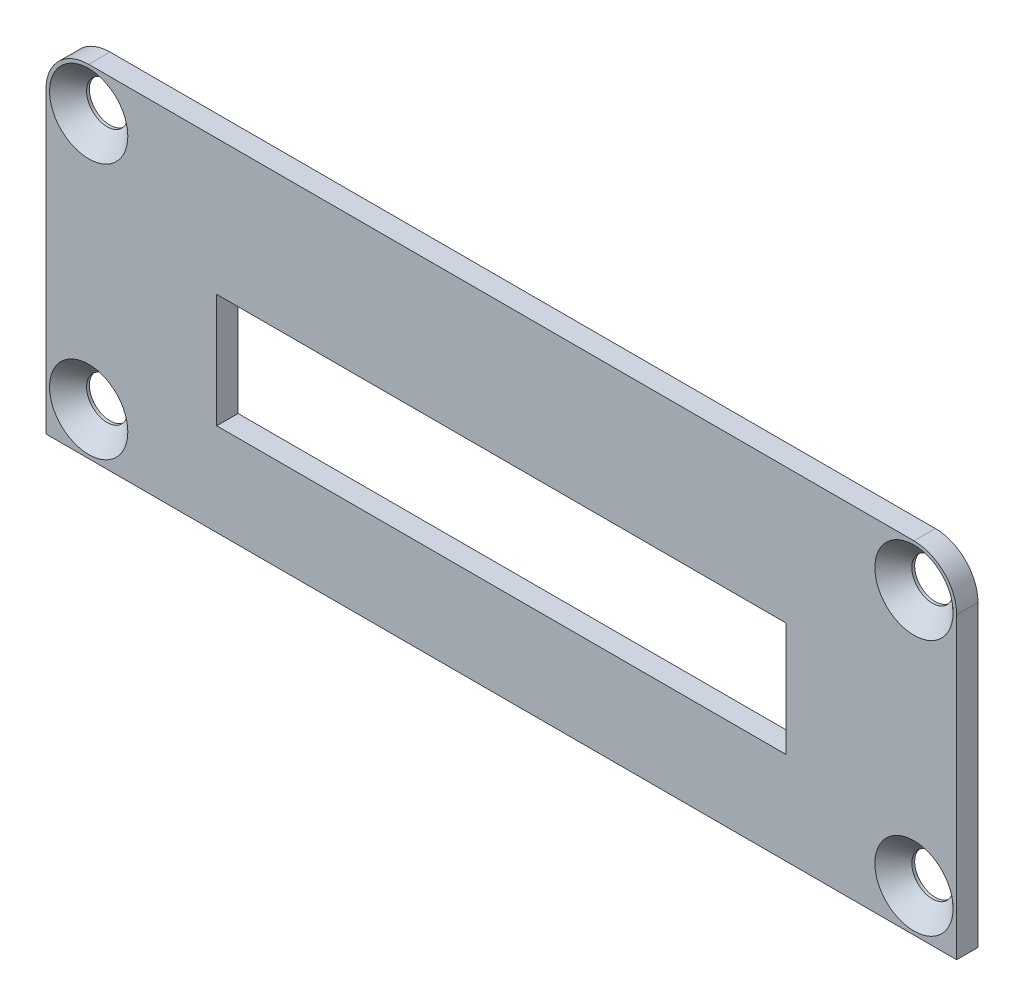
ISO-10303-21;
HEADER;
FILE_DESCRIPTION(('STEP AP214'),'2;1');
FILE_NAME('part.step','',(''),(''),'','','');
FILE_SCHEMA(('AUTOMOTIVE_DESIGN { 1 0 10303 214 1 1 1 1 }'));
ENDSEC;
DATA;
#1=APPLICATION_CONTEXT('core data for automotive mechanical design processes');
#2=APPLICATION_PROTOCOL_DEFINITION('international standard','automotive_design',2000,#1);
#3=PRODUCT_CONTEXT('',#1,'mechanical');
#4=PRODUCT('Part','Part','',(#3));
#5=PRODUCT_RELATED_PRODUCT_CATEGORY('part','',(#4));
#6=PRODUCT_DEFINITION_FORMATION('','',#4);
#7=PRODUCT_DEFINITION_CONTEXT('part definition',#1,'design');
#8=PRODUCT_DEFINITION('design','',#6,#7);
#9=PRODUCT_DEFINITION_SHAPE('','',#8);
#10=(LENGTH_UNIT() NAMED_UNIT(*) SI_UNIT(.MILLI.,.METRE.));
#11=(NAMED_UNIT(*) PLANE_ANGLE_UNIT() SI_UNIT($,.RADIAN.));
#12=(NAMED_UNIT(*) SI_UNIT($,.STERADIAN.) SOLID_ANGLE_UNIT());
#13=UNCERTAINTY_MEASURE_WITH_UNIT(LENGTH_MEASURE(1.E-05),#10,'distance_accuracy_value','');
#14=(GEOMETRIC_REPRESENTATION_CONTEXT(3) GLOBAL_UNCERTAINTY_ASSIGNED_CONTEXT((#13)) GLOBAL_UNIT_ASSIGNED_CONTEXT((#10,
#11,#12)) REPRESENTATION_CONTEXT('',''));
#15=CARTESIAN_POINT('',(0.,0.,0.));
#16=DIRECTION('',(0.,0.,1.));
#17=DIRECTION('',(1.,0.,0.));
#18=AXIS2_PLACEMENT_3D('',#15,#16,#17);
#19=CARTESIAN_POINT('',(32.,12.,-1.5));
#20=DIRECTION('',(1.,0.,0.));
#21=DIRECTION('',(0.,0.,-1.));
#22=AXIS2_PLACEMENT_3D('',#19,#20,#21);
#23=PLANE('',#22);
#24=DIRECTION('',(0.,1.,0.));
#25=VECTOR('',#24,1.);
#26=CARTESIAN_POINT('',(32.,12.,-1.5));
#27=LINE('',#26,#25);
#28=CARTESIAN_POINT('',(32.,-12.,-1.5));
#29=VERTEX_POINT('',#28);
#30=CARTESIAN_POINT('',(32.,9.,-1.5));
#31=VERTEX_POINT('',#30);
#32=EDGE_CURVE('E159',#29,#31,#27,.T.);
#33=ORIENTED_EDGE('',*,*,#32,.T.);
#34=DIRECTION('',(0.,0.,1.));
#35=VECTOR('',#34,1.);
#36=CARTESIAN_POINT('',(32.,9.,-1.5));
#37=LINE('',#36,#35);
#38=CARTESIAN_POINT('',(32.,9.,0.));
#39=VERTEX_POINT('',#38);
#40=EDGE_CURVE('E11',#31,#39,#37,.T.);
#41=ORIENTED_EDGE('',*,*,#40,.T.);
#42=DIRECTION('',(0.,1.,0.));
#43=VECTOR('',#42,1.);
#44=CARTESIAN_POINT('',(32.,12.,0.));
#45=LINE('',#44,#43);
#46=CARTESIAN_POINT('',(32.,-12.,0.));
#47=VERTEX_POINT('',#46);
#48=EDGE_CURVE('E155',#47,#39,#45,.T.);
#49=ORIENTED_EDGE('',*,*,#48,.F.);
#50=DIRECTION('',(0.,0.,1.));
#51=VECTOR('',#50,1.);
#52=CARTESIAN_POINT('',(32.,-12.,-1.5));
#53=LINE('',#52,#51);
#54=EDGE_CURVE('E180',#29,#47,#53,.T.);
#55=ORIENTED_EDGE('',*,*,#54,.F.);
#56=EDGE_LOOP('',(#33,#41,#49,#55));
#57=FACE_BOUND('',#56,.T.);
#58=ADVANCED_FACE('F33',(#57),#23,.T.);
#59=CARTESIAN_POINT('',(-32.,-12.,-1.5));
#60=DIRECTION('',(0.,-1.,0.));
#61=DIRECTION('',(0.,0.,-1.));
#62=AXIS2_PLACEMENT_3D('',#59,#60,#61);
#63=PLANE('',#62);
#64=DIRECTION('',(1.,0.,0.));
#65=VECTOR('',#64,1.);
#66=CARTESIAN_POINT('',(-32.,-12.,0.));
#67=LINE('',#66,#65);
#68=CARTESIAN_POINT('',(-32.,-12.,0.));
#69=VERTEX_POINT('',#68);
#70=EDGE_CURVE('E162',#69,#47,#67,.T.);
#71=ORIENTED_EDGE('',*,*,#70,.F.);
#72=DIRECTION('',(0.,0.,1.));
#73=VECTOR('',#72,1.);
#74=CARTESIAN_POINT('',(-32.,-12.,-1.5));
#75=LINE('',#74,#73);
#76=CARTESIAN_POINT('',(-32.,-12.,-1.5));
#77=VERTEX_POINT('',#76);
#78=EDGE_CURVE('E170',#77,#69,#75,.T.);
#79=ORIENTED_EDGE('',*,*,#78,.F.);
#80=DIRECTION('',(1.,0.,0.));
#81=VECTOR('',#80,1.);
#82=CARTESIAN_POINT('',(-32.,-12.,-1.5));
#83=LINE('',#82,#81);
#84=EDGE_CURVE('E167',#77,#29,#83,.T.);
#85=ORIENTED_EDGE('',*,*,#84,.T.);
#86=ORIENTED_EDGE('',*,*,#54,.T.);
#87=EDGE_LOOP('',(#71,#79,#85,#86));
#88=FACE_BOUND('',#87,.T.);
#89=ADVANCED_FACE('F209',(#88),#63,.T.);
#90=CARTESIAN_POINT('',(-32.,12.,-1.5));
#91=DIRECTION('',(-1.,0.,0.));
#92=DIRECTION('',(0.,0.,1.));
#93=AXIS2_PLACEMENT_3D('',#90,#91,#92);
#94=PLANE('',#93);
#95=DIRECTION('',(0.,-1.,0.));
#96=VECTOR('',#95,1.);
#97=CARTESIAN_POINT('',(-32.,12.,0.));
#98=LINE('',#97,#96);
#99=CARTESIAN_POINT('',(-32.,9.,0.));
#100=VERTEX_POINT('',#99);
#101=EDGE_CURVE('E176',#100,#69,#98,.T.);
#102=ORIENTED_EDGE('',*,*,#101,.F.);
#103=DIRECTION('',(0.,0.,1.));
#104=VECTOR('',#103,1.);
#105=CARTESIAN_POINT('',(-32.,9.,-1.5));
#106=LINE('',#105,#104);
#107=CARTESIAN_POINT('',(-32.,9.,-1.5));
#108=VERTEX_POINT('',#107);
#109=EDGE_CURVE('E56',#100,#108,#106,.F.);
#110=ORIENTED_EDGE('',*,*,#109,.T.);
#111=DIRECTION('',(0.,-1.,0.));
#112=VECTOR('',#111,1.);
#113=CARTESIAN_POINT('',(-32.,12.,-1.5));
#114=LINE('',#113,#112);
#115=EDGE_CURVE('E165',#108,#77,#114,.T.);
#116=ORIENTED_EDGE('',*,*,#115,.T.);
#117=ORIENTED_EDGE('',*,*,#78,.T.);
#118=EDGE_LOOP('',(#102,#110,#116,#117));
#119=FACE_BOUND('',#118,.T.);
#120=ADVANCED_FACE('F205',(#119),#94,.T.);
#121=CARTESIAN_POINT('',(-32.,12.,-1.5));
#122=DIRECTION('',(0.,1.,0.));
#123=DIRECTION('',(0.,0.,1.));
#124=AXIS2_PLACEMENT_3D('',#121,#122,#123);
#125=PLANE('',#124);
#126=DIRECTION('',(-1.,0.,0.));
#127=VECTOR('',#126,1.);
#128=CARTESIAN_POINT('',(-32.,12.,-1.5));
#129=LINE('',#128,#127);
#130=CARTESIAN_POINT('',(29.,12.,-1.5));
#131=VERTEX_POINT('',#130);
#132=CARTESIAN_POINT('',(-29.,12.,-1.5));
#133=VERTEX_POINT('',#132);
#134=EDGE_CURVE('E161',#131,#133,#129,.T.);
#135=ORIENTED_EDGE('',*,*,#134,.T.);
#136=DIRECTION('',(0.,0.,1.));
#137=VECTOR('',#136,1.);
#138=CARTESIAN_POINT('',(-29.,12.,-1.5));
#139=LINE('',#138,#137);
#140=CARTESIAN_POINT('',(-29.,12.,0.));
#141=VERTEX_POINT('',#140);
#142=EDGE_CURVE('E186',#133,#141,#139,.T.);
#143=ORIENTED_EDGE('',*,*,#142,.T.);
#144=DIRECTION('',(-1.,0.,0.));
#145=VECTOR('',#144,1.);
#146=CARTESIAN_POINT('',(-32.,12.,0.));
#147=LINE('',#146,#145);
#148=CARTESIAN_POINT('',(29.,12.,0.));
#149=VERTEX_POINT('',#148);
#150=EDGE_CURVE('E173',#149,#141,#147,.T.);
#151=ORIENTED_EDGE('',*,*,#150,.F.);
#152=DIRECTION('',(0.,0.,1.));
#153=VECTOR('',#152,1.);
#154=CARTESIAN_POINT('',(29.,12.,-1.5));
#155=LINE('',#154,#153);
#156=EDGE_CURVE('E182',#149,#131,#155,.F.);
#157=ORIENTED_EDGE('',*,*,#156,.T.);
#158=EDGE_LOOP('',(#135,#143,#151,#157));
#159=FACE_BOUND('',#158,.T.);
#160=ADVANCED_FACE('F199',(#159),#125,.T.);
#161=CARTESIAN_POINT('',(0.,0.,-1.5));
#162=DIRECTION('',(0.,0.,1.));
#163=DIRECTION('',(1.,0.,0.));
#164=AXIS2_PLACEMENT_3D('',#161,#162,#163);
#165=PLANE('',#164);
#166=CARTESIAN_POINT('',(-29.,9.,-1.5));
#167=DIRECTION('',(0.,0.,1.));
#168=DIRECTION('',(1.,0.,0.));
#169=AXIS2_PLACEMENT_3D('',#166,#167,#168);
#170=CIRCLE('',#169,1.45);
#171=CARTESIAN_POINT('',(-27.55,9.,-1.5));
#172=VERTEX_POINT('',#171);
#173=EDGE_CURVE('E288',#172,#172,#170,.T.);
#174=ORIENTED_EDGE('',*,*,#173,.T.);
#175=EDGE_LOOP('',(#174));
#176=FACE_BOUND('',#175,.T.);
#177=CARTESIAN_POINT('',(29.,9.,-1.5));
#178=DIRECTION('',(0.,0.,1.));
#179=DIRECTION('',(1.,0.,0.));
#180=AXIS2_PLACEMENT_3D('',#177,#178,#179);
#181=CIRCLE('',#180,1.45);
#182=CARTESIAN_POINT('',(30.45,9.,-1.5));
#183=VERTEX_POINT('',#182);
#184=EDGE_CURVE('E299',#183,#183,#181,.T.);
#185=ORIENTED_EDGE('',*,*,#184,.T.);
#186=EDGE_LOOP('',(#185));
#187=FACE_BOUND('',#186,.T.);
#188=CARTESIAN_POINT('',(-29.,-9.,-1.5));
#189=DIRECTION('',(0.,0.,1.));
#190=DIRECTION('',(1.,0.,0.));
#191=AXIS2_PLACEMENT_3D('',#188,#189,#190);
#192=CIRCLE('',#191,1.45);
#193=CARTESIAN_POINT('',(-27.55,-9.,-1.5));
#194=VERTEX_POINT('',#193);
#195=EDGE_CURVE('E308',#194,#194,#192,.T.);
#196=ORIENTED_EDGE('',*,*,#195,.T.);
#197=EDGE_LOOP('',(#196));
#198=FACE_BOUND('',#197,.T.);
#199=CARTESIAN_POINT('',(29.,-9.,-1.5));
#200=DIRECTION('',(0.,0.,1.));
#201=DIRECTION('',(1.,0.,0.));
#202=AXIS2_PLACEMENT_3D('',#199,#200,#201);
#203=CIRCLE('',#202,1.45);
#204=CARTESIAN_POINT('',(30.45,-9.,-1.5));
#205=VERTEX_POINT('',#204);
#206=EDGE_CURVE('E143',#205,#205,#203,.T.);
#207=ORIENTED_EDGE('',*,*,#206,.T.);
#208=EDGE_LOOP('',(#207));
#209=FACE_BOUND('',#208,.T.);
#210=DIRECTION('',(1.,0.,0.));
#211=VECTOR('',#210,1.);
#212=CARTESIAN_POINT('',(-20.,-5.5,-1.5));
#213=LINE('',#212,#211);
#214=CARTESIAN_POINT('',(-20.,-5.5,-1.5));
#215=VERTEX_POINT('',#214);
#216=CARTESIAN_POINT('',(20.,-5.5,-1.5));
#217=VERTEX_POINT('',#216);
#218=EDGE_CURVE('E125',#215,#217,#213,.T.);
#219=ORIENTED_EDGE('',*,*,#218,.T.);
#220=DIRECTION('',(0.,1.,0.));
#221=VECTOR('',#220,1.);
#222=CARTESIAN_POINT('',(20.,2.5,-1.5));
#223=LINE('',#222,#221);
#224=CARTESIAN_POINT('',(20.,2.5,-1.5));
#225=VERTEX_POINT('',#224);
#226=EDGE_CURVE('E117',#217,#225,#223,.T.);
#227=ORIENTED_EDGE('',*,*,#226,.T.);
#228=DIRECTION('',(-1.,0.,0.));
#229=VECTOR('',#228,1.);
#230=CARTESIAN_POINT('',(-20.,2.5,-1.5));
#231=LINE('',#230,#229);
#232=CARTESIAN_POINT('',(-20.,2.5,-1.5));
#233=VERTEX_POINT('',#232);
#234=EDGE_CURVE('E129',#225,#233,#231,.T.);
#235=ORIENTED_EDGE('',*,*,#234,.T.);
#236=DIRECTION('',(0.,-1.,0.));
#237=VECTOR('',#236,1.);
#238=CARTESIAN_POINT('',(-20.,2.5,-1.5));
#239=LINE('',#238,#237);
#240=EDGE_CURVE('E133',#233,#215,#239,.T.);
#241=ORIENTED_EDGE('',*,*,#240,.T.);
#242=EDGE_LOOP('',(#219,#227,#235,#241));
#243=FACE_BOUND('',#242,.T.);
#244=ORIENTED_EDGE('',*,*,#115,.F.);
#245=CARTESIAN_POINT('',(-29.,9.,-1.5));
#246=DIRECTION('',(0.,0.,1.));
#247=DIRECTION('',(1.,0.,0.));
#248=AXIS2_PLACEMENT_3D('',#245,#246,#247);
#249=CIRCLE('',#248,3.);
#250=EDGE_CURVE('E41',#108,#133,#249,.F.);
#251=ORIENTED_EDGE('',*,*,#250,.T.);
#252=ORIENTED_EDGE('',*,*,#134,.F.);
#253=CARTESIAN_POINT('',(29.,9.,-1.5));
#254=DIRECTION('',(0.,0.,1.));
#255=DIRECTION('',(1.,0.,0.));
#256=AXIS2_PLACEMENT_3D('',#253,#254,#255);
#257=CIRCLE('',#256,3.);
#258=EDGE_CURVE('E48',#131,#31,#257,.F.);
#259=ORIENTED_EDGE('',*,*,#258,.T.);
#260=ORIENTED_EDGE('',*,*,#32,.F.);
#261=ORIENTED_EDGE('',*,*,#84,.F.);
#262=EDGE_LOOP('',(#244,#251,#252,#259,#260,#261));
#263=FACE_BOUND('',#262,.T.);
#264=ADVANCED_FACE('F135',(#176,#187,#198,#209,#243,#263),#165,.F.);
#265=CARTESIAN_POINT('',(0.,0.,0.));
#266=DIRECTION('',(0.,0.,1.));
#267=DIRECTION('',(1.,0.,0.));
#268=AXIS2_PLACEMENT_3D('',#265,#266,#267);
#269=PLANE('',#268);
#270=CARTESIAN_POINT('',(-29.,9.,0.));
#271=DIRECTION('',(0.,0.,1.));
#272=DIRECTION('',(1.,0.,0.));
#273=AXIS2_PLACEMENT_3D('',#270,#271,#272);
#274=CIRCLE('',#273,2.75);
#275=CARTESIAN_POINT('',(-26.25,9.,0.));
#276=VERTEX_POINT('',#275);
#277=EDGE_CURVE('E286',#276,#276,#274,.T.);
#278=ORIENTED_EDGE('',*,*,#277,.F.);
#279=EDGE_LOOP('',(#278));
#280=FACE_BOUND('',#279,.T.);
#281=CARTESIAN_POINT('',(29.,9.,0.));
#282=DIRECTION('',(0.,0.,1.));
#283=DIRECTION('',(1.,0.,0.));
#284=AXIS2_PLACEMENT_3D('',#281,#282,#283);
#285=CIRCLE('',#284,2.75);
#286=CARTESIAN_POINT('',(31.75,9.,0.));
#287=VERTEX_POINT('',#286);
#288=EDGE_CURVE('E293',#287,#287,#285,.T.);
#289=ORIENTED_EDGE('',*,*,#288,.F.);
#290=EDGE_LOOP('',(#289));
#291=FACE_BOUND('',#290,.T.);
#292=CARTESIAN_POINT('',(-29.,-9.,0.));
#293=DIRECTION('',(0.,0.,1.));
#294=DIRECTION('',(1.,0.,0.));
#295=AXIS2_PLACEMENT_3D('',#292,#293,#294);
#296=CIRCLE('',#295,2.75);
#297=CARTESIAN_POINT('',(-26.25,-9.,0.));
#298=VERTEX_POINT('',#297);
#299=EDGE_CURVE('E302',#298,#298,#296,.T.);
#300=ORIENTED_EDGE('',*,*,#299,.F.);
#301=EDGE_LOOP('',(#300));
#302=FACE_BOUND('',#301,.T.);
#303=CARTESIAN_POINT('',(29.,-9.,0.));
#304=DIRECTION('',(0.,0.,1.));
#305=DIRECTION('',(1.,0.,0.));
#306=AXIS2_PLACEMENT_3D('',#303,#304,#305);
#307=CIRCLE('',#306,2.75);
#308=CARTESIAN_POINT('',(31.75,-9.,0.));
#309=VERTEX_POINT('',#308);
#310=EDGE_CURVE('E311',#309,#309,#307,.T.);
#311=ORIENTED_EDGE('',*,*,#310,.F.);
#312=EDGE_LOOP('',(#311));
#313=FACE_BOUND('',#312,.T.);
#314=DIRECTION('',(0.,1.,0.));
#315=VECTOR('',#314,1.);
#316=CARTESIAN_POINT('',(20.,2.5,0.));
#317=LINE('',#316,#315);
#318=CARTESIAN_POINT('',(20.,-5.5,0.));
#319=VERTEX_POINT('',#318);
#320=CARTESIAN_POINT('',(20.,2.5,0.));
#321=VERTEX_POINT('',#320);
#322=EDGE_CURVE('E120',#319,#321,#317,.T.);
#323=ORIENTED_EDGE('',*,*,#322,.F.);
#324=DIRECTION('',(1.,0.,0.));
#325=VECTOR('',#324,1.);
#326=CARTESIAN_POINT('',(-20.,-5.5,0.));
#327=LINE('',#326,#325);
#328=CARTESIAN_POINT('',(-20.,-5.5,0.));
#329=VERTEX_POINT('',#328);
#330=EDGE_CURVE('E137',#329,#319,#327,.T.);
#331=ORIENTED_EDGE('',*,*,#330,.F.);
#332=DIRECTION('',(0.,-1.,0.));
#333=VECTOR('',#332,1.);
#334=CARTESIAN_POINT('',(-20.,2.5,0.));
#335=LINE('',#334,#333);
#336=CARTESIAN_POINT('',(-20.,2.5,0.));
#337=VERTEX_POINT('',#336);
#338=EDGE_CURVE('E140',#337,#329,#335,.T.);
#339=ORIENTED_EDGE('',*,*,#338,.F.);
#340=DIRECTION('',(-1.,0.,0.));
#341=VECTOR('',#340,1.);
#342=CARTESIAN_POINT('',(-20.,2.5,0.));
#343=LINE('',#342,#341);
#344=EDGE_CURVE('E149',#321,#337,#343,.T.);
#345=ORIENTED_EDGE('',*,*,#344,.F.);
#346=EDGE_LOOP('',(#323,#331,#339,#345));
#347=FACE_BOUND('',#346,.T.);
#348=ORIENTED_EDGE('',*,*,#150,.T.);
#349=CARTESIAN_POINT('',(-29.,9.,0.));
#350=DIRECTION('',(0.,0.,1.));
#351=DIRECTION('',(1.,0.,0.));
#352=AXIS2_PLACEMENT_3D('',#349,#350,#351);
#353=CIRCLE('',#352,3.);
#354=EDGE_CURVE('E191',#141,#100,#353,.T.);
#355=ORIENTED_EDGE('',*,*,#354,.T.);
#356=ORIENTED_EDGE('',*,*,#101,.T.);
#357=ORIENTED_EDGE('',*,*,#70,.T.);
#358=ORIENTED_EDGE('',*,*,#48,.T.);
#359=CARTESIAN_POINT('',(29.,9.,0.));
#360=DIRECTION('',(0.,0.,1.));
#361=DIRECTION('',(1.,0.,0.));
#362=AXIS2_PLACEMENT_3D('',#359,#360,#361);
#363=CIRCLE('',#362,3.);
#364=EDGE_CURVE('E189',#39,#149,#363,.T.);
#365=ORIENTED_EDGE('',*,*,#364,.T.);
#366=EDGE_LOOP('',(#348,#355,#356,#357,#358,#365));
#367=FACE_BOUND('',#366,.T.);
#368=ADVANCED_FACE('F204',(#280,#291,#302,#313,#347,#367),#269,.T.);
#369=CARTESIAN_POINT('',(20.,2.5,-1.5));
#370=DIRECTION('',(1.,0.,0.));
#371=DIRECTION('',(0.,1.,0.));
#372=AXIS2_PLACEMENT_3D('',#369,#370,#371);
#373=PLANE('',#372);
#374=ORIENTED_EDGE('',*,*,#322,.T.);
#375=DIRECTION('',(0.,0.,1.));
#376=VECTOR('',#375,1.);
#377=CARTESIAN_POINT('',(20.,2.5,-1.5));
#378=LINE('',#377,#376);
#379=EDGE_CURVE('E113',#225,#321,#378,.T.);
#380=ORIENTED_EDGE('',*,*,#379,.F.);
#381=ORIENTED_EDGE('',*,*,#226,.F.);
#382=DIRECTION('',(0.,0.,1.));
#383=VECTOR('',#382,1.);
#384=CARTESIAN_POINT('',(20.,-5.5,-1.5));
#385=LINE('',#384,#383);
#386=EDGE_CURVE('E153',#217,#319,#385,.T.);
#387=ORIENTED_EDGE('',*,*,#386,.T.);
#388=EDGE_LOOP('',(#374,#380,#381,#387));
#389=FACE_BOUND('',#388,.T.);
#390=ADVANCED_FACE('F115',(#389),#373,.F.);
#391=CARTESIAN_POINT('',(-20.,-5.5,-1.5));
#392=DIRECTION('',(0.,-1.,0.));
#393=DIRECTION('',(0.,0.,-1.));
#394=AXIS2_PLACEMENT_3D('',#391,#392,#393);
#395=PLANE('',#394);
#396=ORIENTED_EDGE('',*,*,#330,.T.);
#397=ORIENTED_EDGE('',*,*,#386,.F.);
#398=ORIENTED_EDGE('',*,*,#218,.F.);
#399=DIRECTION('',(0.,0.,1.));
#400=VECTOR('',#399,1.);
#401=CARTESIAN_POINT('',(-20.,-5.5,-1.5));
#402=LINE('',#401,#400);
#403=EDGE_CURVE('E156',#215,#329,#402,.T.);
#404=ORIENTED_EDGE('',*,*,#403,.T.);
#405=EDGE_LOOP('',(#396,#397,#398,#404));
#406=FACE_BOUND('',#405,.T.);
#407=ADVANCED_FACE('F242',(#406),#395,.F.);
#408=CARTESIAN_POINT('',(-20.,2.5,-1.5));
#409=DIRECTION('',(-1.,0.,0.));
#410=DIRECTION('',(0.,-1.,0.));
#411=AXIS2_PLACEMENT_3D('',#408,#409,#410);
#412=PLANE('',#411);
#413=ORIENTED_EDGE('',*,*,#338,.T.);
#414=ORIENTED_EDGE('',*,*,#403,.F.);
#415=ORIENTED_EDGE('',*,*,#240,.F.);
#416=DIRECTION('',(0.,0.,1.));
#417=VECTOR('',#416,1.);
#418=CARTESIAN_POINT('',(-20.,2.5,-1.5));
#419=LINE('',#418,#417);
#420=EDGE_CURVE('E124',#233,#337,#419,.T.);
#421=ORIENTED_EDGE('',*,*,#420,.T.);
#422=EDGE_LOOP('',(#413,#414,#415,#421));
#423=FACE_BOUND('',#422,.T.);
#424=ADVANCED_FACE('F245',(#423),#412,.F.);
#425=CARTESIAN_POINT('',(-20.,2.5,-1.5));
#426=DIRECTION('',(0.,1.,0.));
#427=DIRECTION('',(0.,0.,1.));
#428=AXIS2_PLACEMENT_3D('',#425,#426,#427);
#429=PLANE('',#428);
#430=ORIENTED_EDGE('',*,*,#344,.T.);
#431=ORIENTED_EDGE('',*,*,#420,.F.);
#432=ORIENTED_EDGE('',*,*,#234,.F.);
#433=ORIENTED_EDGE('',*,*,#379,.T.);
#434=EDGE_LOOP('',(#430,#431,#432,#433));
#435=FACE_BOUND('',#434,.T.);
#436=ADVANCED_FACE('F130',(#435),#429,.F.);
#437=CARTESIAN_POINT('',(-29.,9.,-1.5));
#438=DIRECTION('',(0.,0.,1.));
#439=DIRECTION('',(1.,0.,0.));
#440=AXIS2_PLACEMENT_3D('',#437,#438,#439);
#441=CYLINDRICAL_SURFACE('',#440,3.);
#442=ORIENTED_EDGE('',*,*,#250,.F.);
#443=ORIENTED_EDGE('',*,*,#109,.F.);
#444=ORIENTED_EDGE('',*,*,#354,.F.);
#445=ORIENTED_EDGE('',*,*,#142,.F.);
#446=EDGE_LOOP('',(#442,#443,#444,#445));
#447=FACE_BOUND('',#446,.T.);
#448=ADVANCED_FACE('F202',(#447),#441,.T.);
#449=CARTESIAN_POINT('',(29.,9.,-1.5));
#450=DIRECTION('',(0.,0.,1.));
#451=DIRECTION('',(1.,0.,0.));
#452=AXIS2_PLACEMENT_3D('',#449,#450,#451);
#453=CYLINDRICAL_SURFACE('',#452,3.);
#454=ORIENTED_EDGE('',*,*,#258,.F.);
#455=ORIENTED_EDGE('',*,*,#156,.F.);
#456=ORIENTED_EDGE('',*,*,#364,.F.);
#457=ORIENTED_EDGE('',*,*,#40,.F.);
#458=EDGE_LOOP('',(#454,#455,#456,#457));
#459=FACE_BOUND('',#458,.T.);
#460=ADVANCED_FACE('F35',(#459),#453,.T.);
#461=CARTESIAN_POINT('',(29.,-9.,0.));
#462=DIRECTION('',(0.,0.,1.));
#463=DIRECTION('',(1.,0.,0.));
#464=AXIS2_PLACEMENT_3D('',#461,#462,#463);
#465=CYLINDRICAL_SURFACE('',#464,1.45);
#466=ORIENTED_EDGE('',*,*,#206,.F.);
#467=EDGE_LOOP('',(#466));
#468=FACE_BOUND('',#467,.T.);
#469=CARTESIAN_POINT('',(29.,-9.,-1.3));
#470=DIRECTION('',(0.,0.,1.));
#471=DIRECTION('',(1.,0.,0.));
#472=AXIS2_PLACEMENT_3D('',#469,#470,#471);
#473=CIRCLE('',#472,1.45);
#474=CARTESIAN_POINT('',(30.45,-9.,-1.3));
#475=VERTEX_POINT('',#474);
#476=EDGE_CURVE('E313',#475,#475,#473,.T.);
#477=ORIENTED_EDGE('',*,*,#476,.T.);
#478=EDGE_LOOP('',(#477));
#479=FACE_BOUND('',#478,.T.);
#480=ADVANCED_FACE('F215',(#468,#479),#465,.F.);
#481=CARTESIAN_POINT('',(29.,-9.,0.));
#482=DIRECTION('',(0.,0.,1.));
#483=DIRECTION('',(1.,0.,0.));
#484=AXIS2_PLACEMENT_3D('',#481,#482,#483);
#485=CONICAL_SURFACE('',#484,2.75,0.785398163397447);
#486=ORIENTED_EDGE('',*,*,#476,.F.);
#487=EDGE_LOOP('',(#486));
#488=FACE_BOUND('',#487,.T.);
#489=ORIENTED_EDGE('',*,*,#310,.T.);
#490=EDGE_LOOP('',(#489));
#491=FACE_BOUND('',#490,.T.);
#492=ADVANCED_FACE('F220',(#488,#491),#485,.F.);
#493=CARTESIAN_POINT('',(-29.,-9.,0.));
#494=DIRECTION('',(0.,0.,1.));
#495=DIRECTION('',(1.,0.,0.));
#496=AXIS2_PLACEMENT_3D('',#493,#494,#495);
#497=CYLINDRICAL_SURFACE('',#496,1.45);
#498=ORIENTED_EDGE('',*,*,#195,.F.);
#499=EDGE_LOOP('',(#498));
#500=FACE_BOUND('',#499,.T.);
#501=CARTESIAN_POINT('',(-29.,-9.,-1.3));
#502=DIRECTION('',(0.,0.,1.));
#503=DIRECTION('',(1.,0.,0.));
#504=AXIS2_PLACEMENT_3D('',#501,#502,#503);
#505=CIRCLE('',#504,1.45);
#506=CARTESIAN_POINT('',(-27.55,-9.,-1.3));
#507=VERTEX_POINT('',#506);
#508=EDGE_CURVE('E305',#507,#507,#505,.T.);
#509=ORIENTED_EDGE('',*,*,#508,.T.);
#510=EDGE_LOOP('',(#509));
#511=FACE_BOUND('',#510,.T.);
#512=ADVANCED_FACE('F254',(#500,#511),#497,.F.);
#513=CARTESIAN_POINT('',(-29.,-9.,0.));
#514=DIRECTION('',(0.,0.,1.));
#515=DIRECTION('',(1.,0.,0.));
#516=AXIS2_PLACEMENT_3D('',#513,#514,#515);
#517=CONICAL_SURFACE('',#516,2.75,0.785398163397447);
#518=ORIENTED_EDGE('',*,*,#508,.F.);
#519=EDGE_LOOP('',(#518));
#520=FACE_BOUND('',#519,.T.);
#521=ORIENTED_EDGE('',*,*,#299,.T.);
#522=EDGE_LOOP('',(#521));
#523=FACE_BOUND('',#522,.T.);
#524=ADVANCED_FACE('F258',(#520,#523),#517,.F.);
#525=CARTESIAN_POINT('',(29.,9.,0.));
#526=DIRECTION('',(0.,0.,1.));
#527=DIRECTION('',(1.,0.,0.));
#528=AXIS2_PLACEMENT_3D('',#525,#526,#527);
#529=CYLINDRICAL_SURFACE('',#528,1.45);
#530=ORIENTED_EDGE('',*,*,#184,.F.);
#531=EDGE_LOOP('',(#530));
#532=FACE_BOUND('',#531,.T.);
#533=CARTESIAN_POINT('',(29.,9.,-1.3));
#534=DIRECTION('',(0.,0.,1.));
#535=DIRECTION('',(1.,0.,0.));
#536=AXIS2_PLACEMENT_3D('',#533,#534,#535);
#537=CIRCLE('',#536,1.45);
#538=CARTESIAN_POINT('',(30.45,9.,-1.3));
#539=VERTEX_POINT('',#538);
#540=EDGE_CURVE('E296',#539,#539,#537,.T.);
#541=ORIENTED_EDGE('',*,*,#540,.T.);
#542=EDGE_LOOP('',(#541));
#543=FACE_BOUND('',#542,.T.);
#544=ADVANCED_FACE('F262',(#532,#543),#529,.F.);
#545=CARTESIAN_POINT('',(29.,9.,0.));
#546=DIRECTION('',(0.,0.,1.));
#547=DIRECTION('',(1.,0.,0.));
#548=AXIS2_PLACEMENT_3D('',#545,#546,#547);
#549=CONICAL_SURFACE('',#548,2.75,0.785398163397447);
#550=ORIENTED_EDGE('',*,*,#540,.F.);
#551=EDGE_LOOP('',(#550));
#552=FACE_BOUND('',#551,.T.);
#553=ORIENTED_EDGE('',*,*,#288,.T.);
#554=EDGE_LOOP('',(#553));
#555=FACE_BOUND('',#554,.T.);
#556=ADVANCED_FACE('F266',(#552,#555),#549,.F.);
#557=CARTESIAN_POINT('',(-29.,9.,0.));
#558=DIRECTION('',(0.,0.,1.));
#559=DIRECTION('',(1.,0.,0.));
#560=AXIS2_PLACEMENT_3D('',#557,#558,#559);
#561=CYLINDRICAL_SURFACE('',#560,1.45);
#562=ORIENTED_EDGE('',*,*,#173,.F.);
#563=EDGE_LOOP('',(#562));
#564=FACE_BOUND('',#563,.T.);
#565=CARTESIAN_POINT('',(-29.,9.,-1.3));
#566=DIRECTION('',(0.,0.,1.));
#567=DIRECTION('',(1.,0.,0.));
#568=AXIS2_PLACEMENT_3D('',#565,#566,#567);
#569=CIRCLE('',#568,1.45);
#570=CARTESIAN_POINT('',(-27.55,9.,-1.3));
#571=VERTEX_POINT('',#570);
#572=EDGE_CURVE('E283',#571,#571,#569,.T.);
#573=ORIENTED_EDGE('',*,*,#572,.T.);
#574=EDGE_LOOP('',(#573));
#575=FACE_BOUND('',#574,.T.);
#576=ADVANCED_FACE('F270',(#564,#575),#561,.F.);
#577=CARTESIAN_POINT('',(-29.,9.,0.));
#578=DIRECTION('',(0.,0.,1.));
#579=DIRECTION('',(1.,0.,0.));
#580=AXIS2_PLACEMENT_3D('',#577,#578,#579);
#581=CONICAL_SURFACE('',#580,2.75,0.785398163397447);
#582=ORIENTED_EDGE('',*,*,#572,.F.);
#583=EDGE_LOOP('',(#582));
#584=FACE_BOUND('',#583,.T.);
#585=ORIENTED_EDGE('',*,*,#277,.T.);
#586=EDGE_LOOP('',(#585));
#587=FACE_BOUND('',#586,.T.);
#588=ADVANCED_FACE('F274',(#584,#587),#581,.F.);
#589=CLOSED_SHELL('',(#58,#89,#120,#160,#264,#368,#390,#407,#424,#436,#448,#460,#480,#492,#512,
#524,#544,#556,#576,#588));
#590=MANIFOLD_SOLID_BREP('B2',#589);
#591=ADVANCED_BREP_SHAPE_REPRESENTATION('',(#18,#590),#14);
#592=SHAPE_DEFINITION_REPRESENTATION(#9,#591);
ENDSEC;
END-ISO-10303-21;
